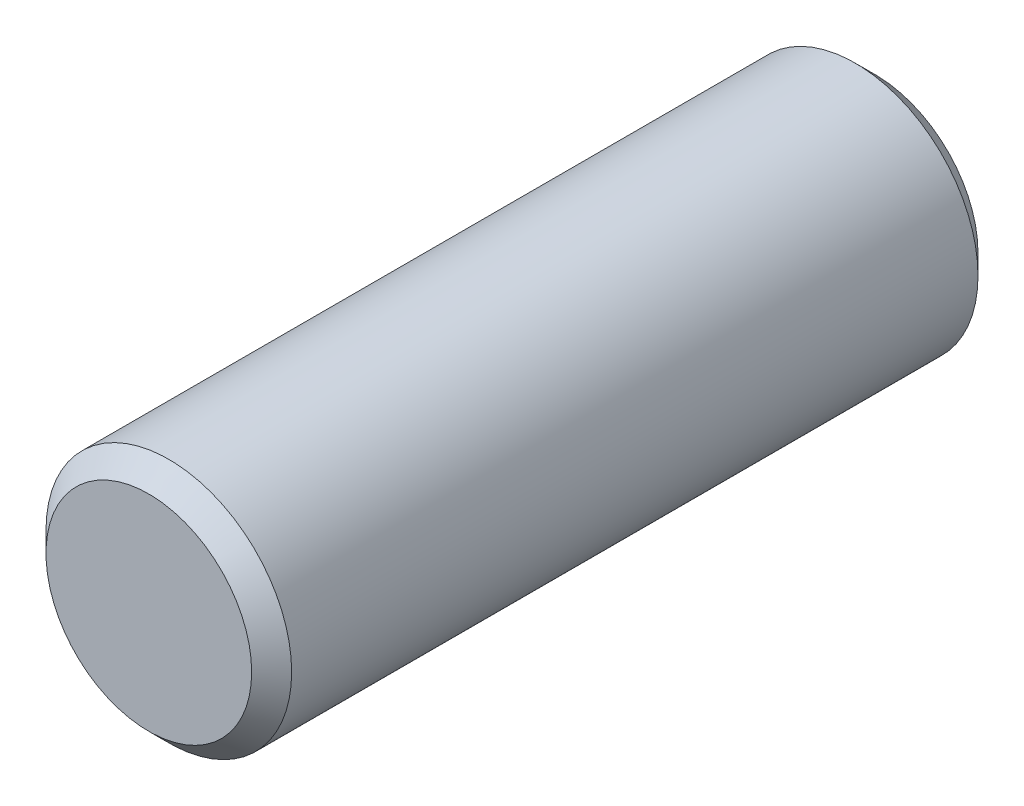
ISO-10303-21;
HEADER;
FILE_DESCRIPTION(('STEP AP214'),'2;1');
FILE_NAME('part.step','',(''),(''),'','','');
FILE_SCHEMA(('AUTOMOTIVE_DESIGN { 1 0 10303 214 1 1 1 1 }'));
ENDSEC;
DATA;
#1=APPLICATION_CONTEXT('core data for automotive mechanical design processes');
#2=APPLICATION_PROTOCOL_DEFINITION('international standard','automotive_design',2000,#1);
#3=PRODUCT_CONTEXT('',#1,'mechanical');
#4=PRODUCT('Part','Part','',(#3));
#5=PRODUCT_RELATED_PRODUCT_CATEGORY('part','',(#4));
#6=PRODUCT_DEFINITION_FORMATION('','',#4);
#7=PRODUCT_DEFINITION_CONTEXT('part definition',#1,'design');
#8=PRODUCT_DEFINITION('design','',#6,#7);
#9=PRODUCT_DEFINITION_SHAPE('','',#8);
#10=(LENGTH_UNIT() NAMED_UNIT(*) SI_UNIT(.MILLI.,.METRE.));
#11=(NAMED_UNIT(*) PLANE_ANGLE_UNIT() SI_UNIT($,.RADIAN.));
#12=(NAMED_UNIT(*) SI_UNIT($,.STERADIAN.) SOLID_ANGLE_UNIT());
#13=UNCERTAINTY_MEASURE_WITH_UNIT(LENGTH_MEASURE(1.E-05),#10,'distance_accuracy_value','');
#14=(GEOMETRIC_REPRESENTATION_CONTEXT(3) GLOBAL_UNCERTAINTY_ASSIGNED_CONTEXT((#13)) GLOBAL_UNIT_ASSIGNED_CONTEXT((#10,
#11,#12)) REPRESENTATION_CONTEXT('',''));
#15=CARTESIAN_POINT('',(0.,0.,0.));
#16=DIRECTION('',(0.,0.,1.));
#17=DIRECTION('',(1.,0.,0.));
#18=AXIS2_PLACEMENT_3D('',#15,#16,#17);
#19=CARTESIAN_POINT('',(0.,0.,18.45));
#20=DIRECTION('',(0.,0.,-1.));
#21=DIRECTION('',(-1.,0.,0.));
#22=AXIS2_PLACEMENT_3D('',#19,#20,#21);
#23=CYLINDRICAL_SURFACE('',#22,3.12);
#24=CARTESIAN_POINT('',(0.,0.,0.507999999999998));
#25=DIRECTION('',(0.,0.,1.));
#26=DIRECTION('',(1.,0.,0.));
#27=AXIS2_PLACEMENT_3D('',#24,#25,#26);
#28=CIRCLE('',#27,3.12);
#29=CARTESIAN_POINT('',(3.12,0.,0.507999999999998));
#30=VERTEX_POINT('',#29);
#31=EDGE_CURVE('E41',#30,#30,#28,.T.);
#32=ORIENTED_EDGE('',*,*,#31,.T.);
#33=EDGE_LOOP('',(#32));
#34=FACE_BOUND('',#33,.T.);
#35=CARTESIAN_POINT('',(0.,0.,17.942));
#36=DIRECTION('',(0.,0.,1.));
#37=DIRECTION('',(1.,0.,0.));
#38=AXIS2_PLACEMENT_3D('',#35,#36,#37);
#39=CIRCLE('',#38,3.12);
#40=CARTESIAN_POINT('',(3.12,0.,17.942));
#41=VERTEX_POINT('',#40);
#42=EDGE_CURVE('E45',#41,#41,#39,.F.);
#43=ORIENTED_EDGE('',*,*,#42,.T.);
#44=EDGE_LOOP('',(#43));
#45=FACE_BOUND('',#44,.T.);
#46=ADVANCED_FACE('F30',(#34,#45),#23,.T.);
#47=CARTESIAN_POINT('',(0.,0.,18.45));
#48=DIRECTION('',(0.,0.,1.));
#49=DIRECTION('',(1.,0.,0.));
#50=AXIS2_PLACEMENT_3D('',#47,#48,#49);
#51=PLANE('',#50);
#52=CARTESIAN_POINT('',(0.,0.,18.45));
#53=DIRECTION('',(0.,0.,1.));
#54=DIRECTION('',(1.,0.,0.));
#55=AXIS2_PLACEMENT_3D('',#52,#53,#54);
#56=CIRCLE('',#55,2.612);
#57=CARTESIAN_POINT('',(2.612,0.,18.45));
#58=VERTEX_POINT('',#57);
#59=EDGE_CURVE('E10',#58,#58,#56,.T.);
#60=ORIENTED_EDGE('',*,*,#59,.T.);
#61=EDGE_LOOP('',(#60));
#62=FACE_BOUND('',#61,.T.);
#63=ADVANCED_FACE('F61',(#62),#51,.T.);
#64=CARTESIAN_POINT('',(0.,0.,0.));
#65=DIRECTION('',(0.,0.,1.));
#66=DIRECTION('',(1.,0.,0.));
#67=AXIS2_PLACEMENT_3D('',#64,#65,#66);
#68=PLANE('',#67);
#69=CARTESIAN_POINT('',(0.,0.,0.));
#70=DIRECTION('',(0.,0.,1.));
#71=DIRECTION('',(1.,0.,0.));
#72=AXIS2_PLACEMENT_3D('',#69,#70,#71);
#73=CIRCLE('',#72,2.612);
#74=CARTESIAN_POINT('',(2.612,0.,0.));
#75=VERTEX_POINT('',#74);
#76=EDGE_CURVE('E37',#75,#75,#73,.F.);
#77=ORIENTED_EDGE('',*,*,#76,.T.);
#78=EDGE_LOOP('',(#77));
#79=FACE_BOUND('',#78,.T.);
#80=ADVANCED_FACE('F58',(#79),#68,.F.);
#81=CARTESIAN_POINT('',(0.,0.,0.507999999999998));
#82=DIRECTION('',(0.,0.,1.));
#83=DIRECTION('',(1.,0.,0.));
#84=AXIS2_PLACEMENT_3D('',#81,#82,#83);
#85=CONICAL_SURFACE('',#84,3.12,0.785398163397449);
#86=ORIENTED_EDGE('',*,*,#76,.F.);
#87=EDGE_LOOP('',(#86));
#88=FACE_BOUND('',#87,.T.);
#89=ORIENTED_EDGE('',*,*,#31,.F.);
#90=EDGE_LOOP('',(#89));
#91=FACE_BOUND('',#90,.T.);
#92=ADVANCED_FACE('F54',(#88,#91),#85,.T.);
#93=CARTESIAN_POINT('',(0.,0.,18.45));
#94=DIRECTION('',(0.,0.,-1.));
#95=DIRECTION('',(-1.,0.,0.));
#96=AXIS2_PLACEMENT_3D('',#93,#94,#95);
#97=CONICAL_SURFACE('',#96,2.612,0.785398163397447);
#98=ORIENTED_EDGE('',*,*,#42,.F.);
#99=EDGE_LOOP('',(#98));
#100=FACE_BOUND('',#99,.T.);
#101=ORIENTED_EDGE('',*,*,#59,.F.);
#102=EDGE_LOOP('',(#101));
#103=FACE_BOUND('',#102,.T.);
#104=ADVANCED_FACE('F32',(#100,#103),#97,.T.);
#105=CLOSED_SHELL('',(#46,#63,#80,#92,#104));
#106=MANIFOLD_SOLID_BREP('B2',#105);
#107=ADVANCED_BREP_SHAPE_REPRESENTATION('',(#18,#106),#14);
#108=SHAPE_DEFINITION_REPRESENTATION(#9,#107);
ENDSEC;
END-ISO-10303-21;
